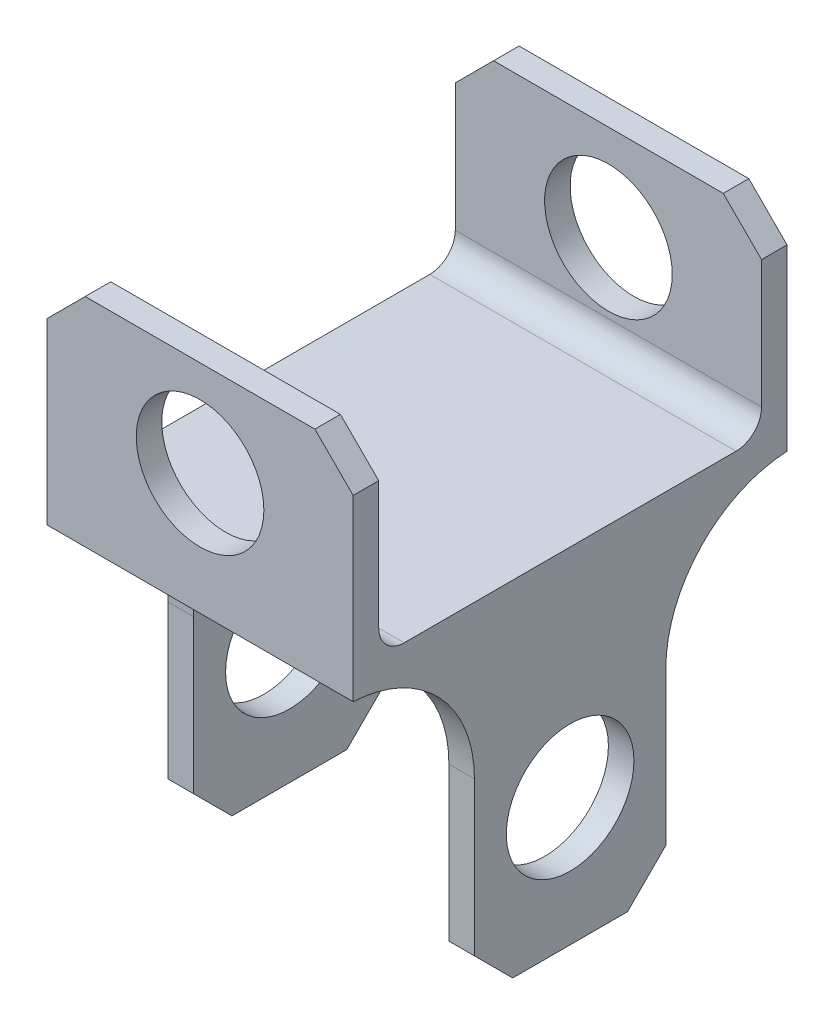
ISO-10303-21;
HEADER;
FILE_DESCRIPTION(('STEP AP214'),'2;1');
FILE_NAME('part.step','',(''),(''),'','','');
FILE_SCHEMA(('AUTOMOTIVE_DESIGN { 1 0 10303 214 1 1 1 1 }'));
ENDSEC;
DATA;
#1=APPLICATION_CONTEXT('core data for automotive mechanical design processes');
#2=APPLICATION_PROTOCOL_DEFINITION('international standard','automotive_design',2000,#1);
#3=PRODUCT_CONTEXT('',#1,'mechanical');
#4=PRODUCT('Part','Part','',(#3));
#5=PRODUCT_RELATED_PRODUCT_CATEGORY('part','',(#4));
#6=PRODUCT_DEFINITION_FORMATION('','',#4);
#7=PRODUCT_DEFINITION_CONTEXT('part definition',#1,'design');
#8=PRODUCT_DEFINITION('design','',#6,#7);
#9=PRODUCT_DEFINITION_SHAPE('','',#8);
#10=(LENGTH_UNIT() NAMED_UNIT(*) SI_UNIT(.MILLI.,.METRE.));
#11=(NAMED_UNIT(*) PLANE_ANGLE_UNIT() SI_UNIT($,.RADIAN.));
#12=(NAMED_UNIT(*) SI_UNIT($,.STERADIAN.) SOLID_ANGLE_UNIT());
#13=UNCERTAINTY_MEASURE_WITH_UNIT(LENGTH_MEASURE(1.E-05),#10,'distance_accuracy_value','');
#14=(GEOMETRIC_REPRESENTATION_CONTEXT(3) GLOBAL_UNCERTAINTY_ASSIGNED_CONTEXT((#13)) GLOBAL_UNIT_ASSIGNED_CONTEXT((#10,
#11,#12)) REPRESENTATION_CONTEXT('',''));
#15=CARTESIAN_POINT('',(0.,0.,0.));
#16=DIRECTION('',(0.,0.,1.));
#17=DIRECTION('',(1.,0.,0.));
#18=AXIS2_PLACEMENT_3D('',#15,#16,#17);
#19=CARTESIAN_POINT('',(0.,0.,2.));
#20=DIRECTION('',(0.,0.,1.));
#21=DIRECTION('',(1.,0.,0.));
#22=AXIS2_PLACEMENT_3D('',#19,#20,#21);
#23=PLANE('',#22);
#24=CARTESIAN_POINT('',(0.,0.,2.));
#25=DIRECTION('',(0.,0.,1.));
#26=DIRECTION('',(1.,0.,0.));
#27=AXIS2_PLACEMENT_3D('',#24,#25,#26);
#28=CIRCLE('',#27,5.);
#29=CARTESIAN_POINT('',(5.,0.,2.));
#30=VERTEX_POINT('',#29);
#31=EDGE_CURVE('E246',#30,#30,#28,.T.);
#32=ORIENTED_EDGE('',*,*,#31,.F.);
#33=EDGE_LOOP('',(#32));
#34=FACE_BOUND('',#33,.T.);
#35=DIRECTION('',(0.,1.,0.));
#36=VECTOR('',#35,1.);
#37=CARTESIAN_POINT('',(12.,0.,2.));
#38=LINE('',#37,#36);
#39=CARTESIAN_POINT('',(12.,-9.5,2.));
#40=VERTEX_POINT('',#39);
#41=CARTESIAN_POINT('',(12.,4.49999999999998,2.));
#42=VERTEX_POINT('',#41);
#43=EDGE_CURVE('E251',#40,#42,#38,.T.);
#44=ORIENTED_EDGE('',*,*,#43,.T.);
#45=DIRECTION('',(-0.707106781186547,0.707106781186548,0.));
#46=VECTOR('',#45,1.);
#47=CARTESIAN_POINT('',(8.25000000000001,8.24999999999998,2.));
#48=LINE('',#47,#46);
#49=CARTESIAN_POINT('',(8.99999999999999,7.5,2.));
#50=VERTEX_POINT('',#49);
#51=EDGE_CURVE('E275',#42,#50,#48,.T.);
#52=ORIENTED_EDGE('',*,*,#51,.T.);
#53=DIRECTION('',(1.,0.,0.));
#54=VECTOR('',#53,1.);
#55=CARTESIAN_POINT('',(0.,7.5,2.));
#56=LINE('',#55,#54);
#57=CARTESIAN_POINT('',(-9.,7.5,2.));
#58=VERTEX_POINT('',#57);
#59=EDGE_CURVE('E254',#58,#50,#56,.T.);
#60=ORIENTED_EDGE('',*,*,#59,.F.);
#61=DIRECTION('',(0.707106781186549,0.707106781186546,0.));
#62=VECTOR('',#61,1.);
#63=CARTESIAN_POINT('',(-8.24999999999998,8.25000000000002,2.));
#64=LINE('',#63,#62);
#65=CARTESIAN_POINT('',(-12.,4.50000000000001,2.));
#66=VERTEX_POINT('',#65);
#67=EDGE_CURVE('E244',#58,#66,#64,.F.);
#68=ORIENTED_EDGE('',*,*,#67,.T.);
#69=DIRECTION('',(0.,1.,0.));
#70=VECTOR('',#69,1.);
#71=CARTESIAN_POINT('',(-12.,0.,2.));
#72=LINE('',#71,#70);
#73=CARTESIAN_POINT('',(-12.,-9.5,2.));
#74=VERTEX_POINT('',#73);
#75=EDGE_CURVE('E227',#74,#66,#72,.T.);
#76=ORIENTED_EDGE('',*,*,#75,.F.);
#77=DIRECTION('',(1.,0.,0.));
#78=VECTOR('',#77,1.);
#79=CARTESIAN_POINT('',(0.,-9.5,2.));
#80=LINE('',#79,#78);
#81=CARTESIAN_POINT('',(-10.,-9.5,2.));
#82=VERTEX_POINT('',#81);
#83=EDGE_CURVE('E241',#74,#82,#80,.T.);
#84=ORIENTED_EDGE('',*,*,#83,.T.);
#85=CARTESIAN_POINT('',(10.,-9.5,2.));
#86=VERTEX_POINT('',#85);
#87=EDGE_CURVE('E252',#82,#86,#80,.T.);
#88=ORIENTED_EDGE('',*,*,#87,.T.);
#89=EDGE_CURVE('E245',#86,#40,#80,.T.);
#90=ORIENTED_EDGE('',*,*,#89,.T.);
#91=EDGE_LOOP('',(#44,#52,#60,#68,#76,#84,#88,#90));
#92=FACE_BOUND('',#91,.T.);
#93=ADVANCED_FACE('F36',(#34,#92),#23,.T.);
#94=CARTESIAN_POINT('',(0.,-9.5,2.));
#95=DIRECTION('',(0.,1.,0.));
#96=DIRECTION('',(-1.,0.,0.));
#97=AXIS2_PLACEMENT_3D('',#94,#95,#96);
#98=PLANE('',#97);
#99=DIRECTION('',(0.,0.,-1.));
#100=VECTOR('',#99,1.);
#101=CARTESIAN_POINT('',(10.,-9.5,-32.));
#102=LINE('',#101,#100);
#103=CARTESIAN_POINT('',(10.,-9.5,-32.));
#104=VERTEX_POINT('',#103);
#105=EDGE_CURVE('E356',#86,#104,#102,.T.);
#106=ORIENTED_EDGE('',*,*,#105,.F.);
#107=ORIENTED_EDGE('',*,*,#87,.F.);
#108=DIRECTION('',(0.,0.,1.));
#109=VECTOR('',#108,1.);
#110=CARTESIAN_POINT('',(-10.,-9.5,-32.));
#111=LINE('',#110,#109);
#112=CARTESIAN_POINT('',(-10.,-9.5,-32.));
#113=VERTEX_POINT('',#112);
#114=EDGE_CURVE('E363',#113,#82,#111,.T.);
#115=ORIENTED_EDGE('',*,*,#114,.F.);
#116=DIRECTION('',(1.,0.,0.));
#117=VECTOR('',#116,1.);
#118=CARTESIAN_POINT('',(0.,-9.5,-32.));
#119=LINE('',#118,#117);
#120=EDGE_CURVE('E390',#113,#104,#119,.T.);
#121=ORIENTED_EDGE('',*,*,#120,.T.);
#122=EDGE_LOOP('',(#106,#107,#115,#121));
#123=FACE_BOUND('',#122,.T.);
#124=ADVANCED_FACE('F511',(#123),#98,.F.);
#125=CARTESIAN_POINT('',(0.,0.,0.));
#126=DIRECTION('',(0.,0.,1.));
#127=DIRECTION('',(1.,0.,0.));
#128=AXIS2_PLACEMENT_3D('',#125,#126,#127);
#129=PLANE('',#128);
#130=CARTESIAN_POINT('',(0.,0.,0.));
#131=DIRECTION('',(0.,0.,1.));
#132=DIRECTION('',(1.,0.,0.));
#133=AXIS2_PLACEMENT_3D('',#130,#131,#132);
#134=CIRCLE('',#133,5.);
#135=CARTESIAN_POINT('',(5.,0.,0.));
#136=VERTEX_POINT('',#135);
#137=EDGE_CURVE('E404',#136,#136,#134,.T.);
#138=ORIENTED_EDGE('',*,*,#137,.T.);
#139=EDGE_LOOP('',(#138));
#140=FACE_BOUND('',#139,.T.);
#141=DIRECTION('',(1.,0.,0.));
#142=VECTOR('',#141,1.);
#143=CARTESIAN_POINT('',(0.,7.5,0.));
#144=LINE('',#143,#142);
#145=CARTESIAN_POINT('',(-9.,7.5,0.));
#146=VERTEX_POINT('',#145);
#147=CARTESIAN_POINT('',(8.99999999999999,7.5,0.));
#148=VERTEX_POINT('',#147);
#149=EDGE_CURVE('E408',#146,#148,#144,.T.);
#150=ORIENTED_EDGE('',*,*,#149,.T.);
#151=DIRECTION('',(0.707106781186547,-0.707106781186548,0.));
#152=VECTOR('',#151,1.);
#153=CARTESIAN_POINT('',(8.99999999999999,7.5,0.));
#154=LINE('',#153,#152);
#155=CARTESIAN_POINT('',(12.,4.49999999999998,0.));
#156=VERTEX_POINT('',#155);
#157=EDGE_CURVE('E470',#148,#156,#154,.T.);
#158=ORIENTED_EDGE('',*,*,#157,.T.);
#159=DIRECTION('',(0.,1.,0.));
#160=VECTOR('',#159,1.);
#161=CARTESIAN_POINT('',(12.,0.,0.));
#162=LINE('',#161,#160);
#163=CARTESIAN_POINT('',(12.,-5.5,0.));
#164=VERTEX_POINT('',#163);
#165=EDGE_CURVE('E271',#164,#156,#162,.T.);
#166=ORIENTED_EDGE('',*,*,#165,.F.);
#167=DIRECTION('',(1.,0.,0.));
#168=VECTOR('',#167,1.);
#169=CARTESIAN_POINT('',(-12.,-5.5,0.));
#170=LINE('',#169,#168);
#171=CARTESIAN_POINT('',(-12.,-5.5,0.));
#172=VERTEX_POINT('',#171);
#173=EDGE_CURVE('E453',#164,#172,#170,.F.);
#174=ORIENTED_EDGE('',*,*,#173,.T.);
#175=DIRECTION('',(0.,1.,0.));
#176=VECTOR('',#175,1.);
#177=CARTESIAN_POINT('',(-12.,0.,0.));
#178=LINE('',#177,#176);
#179=CARTESIAN_POINT('',(-12.,4.50000000000001,0.));
#180=VERTEX_POINT('',#179);
#181=EDGE_CURVE('E415',#172,#180,#178,.T.);
#182=ORIENTED_EDGE('',*,*,#181,.T.);
#183=DIRECTION('',(-0.707106781186549,-0.707106781186546,0.));
#184=VECTOR('',#183,1.);
#185=CARTESIAN_POINT('',(-12.,4.50000000000001,0.));
#186=LINE('',#185,#184);
#187=EDGE_CURVE('E468',#180,#146,#186,.F.);
#188=ORIENTED_EDGE('',*,*,#187,.T.);
#189=EDGE_LOOP('',(#150,#158,#166,#174,#182,#188));
#190=FACE_BOUND('',#189,.T.);
#191=ADVANCED_FACE('F517',(#140,#190),#129,.F.);
#192=CARTESIAN_POINT('',(-12.,0.,2.));
#193=DIRECTION('',(-1.,0.,0.));
#194=DIRECTION('',(0.,0.,1.));
#195=AXIS2_PLACEMENT_3D('',#192,#193,#194);
#196=PLANE('',#195);
#197=CARTESIAN_POINT('',(-12.,-24.5,-15.));
#198=DIRECTION('',(-1.,0.,0.));
#199=DIRECTION('',(0.,0.,1.));
#200=AXIS2_PLACEMENT_3D('',#197,#198,#199);
#201=CIRCLE('',#200,5.);
#202=CARTESIAN_POINT('',(-12.,-24.5,-10.));
#203=VERTEX_POINT('',#202);
#204=EDGE_CURVE('E344',#203,#203,#201,.T.);
#205=ORIENTED_EDGE('',*,*,#204,.F.);
#206=EDGE_LOOP('',(#205));
#207=FACE_BOUND('',#206,.T.);
#208=ORIENTED_EDGE('',*,*,#75,.T.);
#209=DIRECTION('',(0.,0.,-1.));
#210=VECTOR('',#209,1.);
#211=CARTESIAN_POINT('',(-12.,4.50000000000001,2.));
#212=LINE('',#211,#210);
#213=EDGE_CURVE('E289',#66,#180,#212,.T.);
#214=ORIENTED_EDGE('',*,*,#213,.T.);
#215=ORIENTED_EDGE('',*,*,#181,.F.);
#216=CARTESIAN_POINT('',(-12.,-5.5,-2.));
#217=DIRECTION('',(-1.,0.,0.));
#218=DIRECTION('',(0.,0.,1.));
#219=AXIS2_PLACEMENT_3D('',#216,#217,#218);
#220=CIRCLE('',#219,2.);
#221=CARTESIAN_POINT('',(-12.,-7.5,-2.));
#222=VERTEX_POINT('',#221);
#223=EDGE_CURVE('E461',#172,#222,#220,.F.);
#224=ORIENTED_EDGE('',*,*,#223,.T.);
#225=DIRECTION('',(0.,0.,1.));
#226=VECTOR('',#225,1.);
#227=CARTESIAN_POINT('',(-12.,-7.5,-30.));
#228=LINE('',#227,#226);
#229=CARTESIAN_POINT('',(-12.,-7.5,-28.));
#230=VERTEX_POINT('',#229);
#231=EDGE_CURVE('E401',#230,#222,#228,.T.);
#232=ORIENTED_EDGE('',*,*,#231,.F.);
#233=CARTESIAN_POINT('',(-12.,-5.5,-28.));
#234=DIRECTION('',(-1.,0.,0.));
#235=DIRECTION('',(0.,0.,1.));
#236=AXIS2_PLACEMENT_3D('',#233,#234,#235);
#237=CIRCLE('',#236,2.);
#238=CARTESIAN_POINT('',(-12.,-5.5,-30.));
#239=VERTEX_POINT('',#238);
#240=EDGE_CURVE('E457',#230,#239,#237,.F.);
#241=ORIENTED_EDGE('',*,*,#240,.T.);
#242=DIRECTION('',(0.,1.,0.));
#243=VECTOR('',#242,1.);
#244=CARTESIAN_POINT('',(-12.,0.,-30.));
#245=LINE('',#244,#243);
#246=CARTESIAN_POINT('',(-12.,4.49999999999998,-30.));
#247=VERTEX_POINT('',#246);
#248=EDGE_CURVE('E393',#239,#247,#245,.T.);
#249=ORIENTED_EDGE('',*,*,#248,.T.);
#250=DIRECTION('',(0.,0.,-1.));
#251=VECTOR('',#250,1.);
#252=CARTESIAN_POINT('',(-12.,4.49999999999998,-32.));
#253=LINE('',#252,#251);
#254=CARTESIAN_POINT('',(-12.,4.49999999999998,-32.));
#255=VERTEX_POINT('',#254);
#256=EDGE_CURVE('E287',#247,#255,#253,.T.);
#257=ORIENTED_EDGE('',*,*,#256,.T.);
#258=DIRECTION('',(0.,1.,0.));
#259=VECTOR('',#258,1.);
#260=CARTESIAN_POINT('',(-12.,0.,-32.));
#261=LINE('',#260,#259);
#262=CARTESIAN_POINT('',(-12.,-9.5,-32.));
#263=VERTEX_POINT('',#262);
#264=EDGE_CURVE('E375',#263,#255,#261,.T.);
#265=ORIENTED_EDGE('',*,*,#264,.F.);
#266=CARTESIAN_POINT('',(-12.,-19.4874921777191,-32.5));
#267=DIRECTION('',(-1.,0.,0.));
#268=DIRECTION('',(0.,0.,1.));
#269=AXIS2_PLACEMENT_3D('',#266,#267,#268);
#270=CIRCLE('',#269,10.);
#271=CARTESIAN_POINT('',(-12.,-19.4874921777191,-22.5));
#272=VERTEX_POINT('',#271);
#273=EDGE_CURVE('E440',#263,#272,#270,.F.);
#274=ORIENTED_EDGE('',*,*,#273,.T.);
#275=DIRECTION('',(0.,-1.,0.));
#276=VECTOR('',#275,1.);
#277=CARTESIAN_POINT('',(-12.,-9.5,-22.5));
#278=LINE('',#277,#276);
#279=CARTESIAN_POINT('',(-12.,-31.5,-22.5));
#280=VERTEX_POINT('',#279);
#281=EDGE_CURVE('E339',#272,#280,#278,.T.);
#282=ORIENTED_EDGE('',*,*,#281,.T.);
#283=DIRECTION('',(0.,0.707106781186546,-0.707106781186549));
#284=VECTOR('',#283,1.);
#285=CARTESIAN_POINT('',(-12.,-28.0000000000001,-25.9999999999999));
#286=LINE('',#285,#284);
#287=CARTESIAN_POINT('',(-12.,-34.5,-19.5));
#288=VERTEX_POINT('',#287);
#289=EDGE_CURVE('E285',#280,#288,#286,.F.);
#290=ORIENTED_EDGE('',*,*,#289,.T.);
#291=DIRECTION('',(0.,0.,-1.));
#292=VECTOR('',#291,1.);
#293=CARTESIAN_POINT('',(-12.,-34.5,-32.));
#294=LINE('',#293,#292);
#295=CARTESIAN_POINT('',(-12.,-34.5,-10.5));
#296=VERTEX_POINT('',#295);
#297=EDGE_CURVE('E365',#296,#288,#294,.T.);
#298=ORIENTED_EDGE('',*,*,#297,.F.);
#299=DIRECTION('',(0.,-0.707106781186545,-0.70710678118655));
#300=VECTOR('',#299,1.);
#301=CARTESIAN_POINT('',(-12.,-11.0000000000001,13.));
#302=LINE('',#301,#300);
#303=CARTESIAN_POINT('',(-12.,-31.5,-7.5));
#304=VERTEX_POINT('',#303);
#305=EDGE_CURVE('E283',#296,#304,#302,.F.);
#306=ORIENTED_EDGE('',*,*,#305,.T.);
#307=DIRECTION('',(0.,-1.,0.));
#308=VECTOR('',#307,1.);
#309=CARTESIAN_POINT('',(-12.,-9.5,-7.5));
#310=LINE('',#309,#308);
#311=CARTESIAN_POINT('',(-12.,-19.4874921777191,-7.5));
#312=VERTEX_POINT('',#311);
#313=EDGE_CURVE('E230',#312,#304,#310,.T.);
#314=ORIENTED_EDGE('',*,*,#313,.F.);
#315=CARTESIAN_POINT('',(-12.,-19.4874921777191,2.5));
#316=DIRECTION('',(-1.,0.,0.));
#317=DIRECTION('',(0.,0.,1.));
#318=AXIS2_PLACEMENT_3D('',#315,#316,#317);
#319=CIRCLE('',#318,10.);
#320=EDGE_CURVE('E223',#312,#74,#319,.F.);
#321=ORIENTED_EDGE('',*,*,#320,.T.);
#322=EDGE_LOOP('',(#208,#214,#215,#224,#232,#241,#249,#257,#265,#274,#282,#290,#298,#306,#314,#321));
#323=FACE_BOUND('',#322,.T.);
#324=ADVANCED_FACE('F225',(#207,#323),#196,.T.);
#325=CARTESIAN_POINT('',(12.,0.,2.));
#326=DIRECTION('',(-1.,0.,0.));
#327=DIRECTION('',(0.,0.,1.));
#328=AXIS2_PLACEMENT_3D('',#325,#326,#327);
#329=PLANE('',#328);
#330=CARTESIAN_POINT('',(12.,-24.5,-15.));
#331=DIRECTION('',(1.,0.,0.));
#332=DIRECTION('',(0.,0.,-1.));
#333=AXIS2_PLACEMENT_3D('',#330,#331,#332);
#334=CIRCLE('',#333,5.);
#335=CARTESIAN_POINT('',(12.,-24.5,-20.));
#336=VERTEX_POINT('',#335);
#337=EDGE_CURVE('E423',#336,#336,#334,.T.);
#338=ORIENTED_EDGE('',*,*,#337,.F.);
#339=EDGE_LOOP('',(#338));
#340=FACE_BOUND('',#339,.T.);
#341=ORIENTED_EDGE('',*,*,#165,.T.);
#342=DIRECTION('',(0.,0.,1.));
#343=VECTOR('',#342,1.);
#344=CARTESIAN_POINT('',(12.,4.49999999999998,2.));
#345=LINE('',#344,#343);
#346=EDGE_CURVE('E269',#156,#42,#345,.T.);
#347=ORIENTED_EDGE('',*,*,#346,.T.);
#348=ORIENTED_EDGE('',*,*,#43,.F.);
#349=CARTESIAN_POINT('',(12.,-19.4874921777191,2.5));
#350=DIRECTION('',(-1.,0.,0.));
#351=DIRECTION('',(0.,0.,1.));
#352=AXIS2_PLACEMENT_3D('',#349,#350,#351);
#353=CIRCLE('',#352,10.);
#354=CARTESIAN_POINT('',(12.,-19.4874921777191,-7.5));
#355=VERTEX_POINT('',#354);
#356=EDGE_CURVE('E266',#40,#355,#353,.T.);
#357=ORIENTED_EDGE('',*,*,#356,.T.);
#358=DIRECTION('',(0.,-1.,0.));
#359=VECTOR('',#358,1.);
#360=CARTESIAN_POINT('',(12.,-9.5,-7.5));
#361=LINE('',#360,#359);
#362=CARTESIAN_POINT('',(12.,-31.5,-7.5));
#363=VERTEX_POINT('',#362);
#364=EDGE_CURVE('E341',#355,#363,#361,.T.);
#365=ORIENTED_EDGE('',*,*,#364,.T.);
#366=DIRECTION('',(0.,0.707106781186545,0.70710678118655));
#367=VECTOR('',#366,1.);
#368=CARTESIAN_POINT('',(12.,-31.5,-7.5));
#369=LINE('',#368,#367);
#370=CARTESIAN_POINT('',(12.,-34.5,-10.5));
#371=VERTEX_POINT('',#370);
#372=EDGE_CURVE('E472',#363,#371,#369,.F.);
#373=ORIENTED_EDGE('',*,*,#372,.T.);
#374=DIRECTION('',(0.,0.,1.));
#375=VECTOR('',#374,1.);
#376=CARTESIAN_POINT('',(12.,-34.5,-32.));
#377=LINE('',#376,#375);
#378=CARTESIAN_POINT('',(12.,-34.5,-19.5));
#379=VERTEX_POINT('',#378);
#380=EDGE_CURVE('E358',#379,#371,#377,.T.);
#381=ORIENTED_EDGE('',*,*,#380,.F.);
#382=DIRECTION('',(0.,-0.707106781186546,0.707106781186549));
#383=VECTOR('',#382,1.);
#384=CARTESIAN_POINT('',(12.,-31.5,-22.5));
#385=LINE('',#384,#383);
#386=CARTESIAN_POINT('',(12.,-31.5,-22.5));
#387=VERTEX_POINT('',#386);
#388=EDGE_CURVE('E278',#379,#387,#385,.F.);
#389=ORIENTED_EDGE('',*,*,#388,.T.);
#390=DIRECTION('',(0.,-1.,0.));
#391=VECTOR('',#390,1.);
#392=CARTESIAN_POINT('',(12.,-9.5,-22.5));
#393=LINE('',#392,#391);
#394=CARTESIAN_POINT('',(12.,-19.4874921777191,-22.5));
#395=VERTEX_POINT('',#394);
#396=EDGE_CURVE('E352',#395,#387,#393,.T.);
#397=ORIENTED_EDGE('',*,*,#396,.F.);
#398=CARTESIAN_POINT('',(12.,-19.4874921777191,-32.5));
#399=DIRECTION('',(-1.,0.,0.));
#400=DIRECTION('',(0.,0.,1.));
#401=AXIS2_PLACEMENT_3D('',#398,#399,#400);
#402=CIRCLE('',#401,10.);
#403=CARTESIAN_POINT('',(12.,-9.5,-32.));
#404=VERTEX_POINT('',#403);
#405=EDGE_CURVE('E438',#395,#404,#402,.T.);
#406=ORIENTED_EDGE('',*,*,#405,.T.);
#407=DIRECTION('',(0.,1.,0.));
#408=VECTOR('',#407,1.);
#409=CARTESIAN_POINT('',(12.,0.,-32.));
#410=LINE('',#409,#408);
#411=CARTESIAN_POINT('',(12.,4.50000000000001,-32.));
#412=VERTEX_POINT('',#411);
#413=EDGE_CURVE('E382',#404,#412,#410,.T.);
#414=ORIENTED_EDGE('',*,*,#413,.T.);
#415=DIRECTION('',(0.,0.,1.));
#416=VECTOR('',#415,1.);
#417=CARTESIAN_POINT('',(12.,4.50000000000001,2.));
#418=LINE('',#417,#416);
#419=CARTESIAN_POINT('',(12.,4.50000000000001,-30.));
#420=VERTEX_POINT('',#419);
#421=EDGE_CURVE('E273',#412,#420,#418,.T.);
#422=ORIENTED_EDGE('',*,*,#421,.T.);
#423=DIRECTION('',(0.,1.,0.));
#424=VECTOR('',#423,1.);
#425=CARTESIAN_POINT('',(12.,0.,-30.));
#426=LINE('',#425,#424);
#427=CARTESIAN_POINT('',(12.,-5.5,-30.));
#428=VERTEX_POINT('',#427);
#429=EDGE_CURVE('E376',#428,#420,#426,.T.);
#430=ORIENTED_EDGE('',*,*,#429,.F.);
#431=CARTESIAN_POINT('',(12.,-5.5,-28.));
#432=DIRECTION('',(-1.,0.,0.));
#433=DIRECTION('',(0.,0.,1.));
#434=AXIS2_PLACEMENT_3D('',#431,#432,#433);
#435=CIRCLE('',#434,2.);
#436=CARTESIAN_POINT('',(12.,-7.5,-28.));
#437=VERTEX_POINT('',#436);
#438=EDGE_CURVE('E455',#428,#437,#435,.T.);
#439=ORIENTED_EDGE('',*,*,#438,.T.);
#440=DIRECTION('',(0.,0.,1.));
#441=VECTOR('',#440,1.);
#442=CARTESIAN_POINT('',(12.,-7.5,-30.));
#443=LINE('',#442,#441);
#444=CARTESIAN_POINT('',(12.,-7.5,-2.));
#445=VERTEX_POINT('',#444);
#446=EDGE_CURVE('E389',#437,#445,#443,.T.);
#447=ORIENTED_EDGE('',*,*,#446,.T.);
#448=CARTESIAN_POINT('',(12.,-5.5,-2.));
#449=DIRECTION('',(-1.,0.,0.));
#450=DIRECTION('',(0.,0.,1.));
#451=AXIS2_PLACEMENT_3D('',#448,#449,#450);
#452=CIRCLE('',#451,2.);
#453=EDGE_CURVE('E459',#445,#164,#452,.T.);
#454=ORIENTED_EDGE('',*,*,#453,.T.);
#455=EDGE_LOOP('',(#341,#347,#348,#357,#365,#373,#381,#389,#397,#406,#414,#422,#430,#439,#447,#454));
#456=FACE_BOUND('',#455,.T.);
#457=ADVANCED_FACE('F264',(#340,#456),#329,.F.);
#458=CARTESIAN_POINT('',(0.,0.,2.));
#459=DIRECTION('',(0.,0.,-1.));
#460=DIRECTION('',(-1.,0.,0.));
#461=AXIS2_PLACEMENT_3D('',#458,#459,#460);
#462=CYLINDRICAL_SURFACE('',#461,5.);
#463=ORIENTED_EDGE('',*,*,#31,.T.);
#464=EDGE_LOOP('',(#463));
#465=FACE_BOUND('',#464,.T.);
#466=ORIENTED_EDGE('',*,*,#137,.F.);
#467=EDGE_LOOP('',(#466));
#468=FACE_BOUND('',#467,.T.);
#469=ADVANCED_FACE('F530',(#465,#468),#462,.F.);
#470=CARTESIAN_POINT('',(0.,7.5,2.));
#471=DIRECTION('',(0.,1.,0.));
#472=DIRECTION('',(0.,0.,1.));
#473=AXIS2_PLACEMENT_3D('',#470,#471,#472);
#474=PLANE('',#473);
#475=ORIENTED_EDGE('',*,*,#59,.T.);
#476=DIRECTION('',(0.,0.,-1.));
#477=VECTOR('',#476,1.);
#478=CARTESIAN_POINT('',(8.99999999999999,7.5,0.));
#479=LINE('',#478,#477);
#480=EDGE_CURVE('E465',#50,#148,#479,.T.);
#481=ORIENTED_EDGE('',*,*,#480,.T.);
#482=ORIENTED_EDGE('',*,*,#149,.F.);
#483=DIRECTION('',(0.,0.,1.));
#484=VECTOR('',#483,1.);
#485=CARTESIAN_POINT('',(-9.,7.5,2.));
#486=LINE('',#485,#484);
#487=EDGE_CURVE('E463',#146,#58,#486,.T.);
#488=ORIENTED_EDGE('',*,*,#487,.T.);
#489=EDGE_LOOP('',(#475,#481,#482,#488));
#490=FACE_BOUND('',#489,.T.);
#491=ADVANCED_FACE('F527',(#490),#474,.T.);
#492=CARTESIAN_POINT('',(0.,-7.5,-30.));
#493=DIRECTION('',(0.,-1.,0.));
#494=DIRECTION('',(0.,0.,-1.));
#495=AXIS2_PLACEMENT_3D('',#492,#493,#494);
#496=PLANE('',#495);
#497=ORIENTED_EDGE('',*,*,#446,.F.);
#498=DIRECTION('',(1.,0.,0.));
#499=VECTOR('',#498,1.);
#500=CARTESIAN_POINT('',(-12.,-7.5,-28.));
#501=LINE('',#500,#499);
#502=EDGE_CURVE('E451',#437,#230,#501,.F.);
#503=ORIENTED_EDGE('',*,*,#502,.T.);
#504=ORIENTED_EDGE('',*,*,#231,.T.);
#505=DIRECTION('',(1.,0.,0.));
#506=VECTOR('',#505,1.);
#507=CARTESIAN_POINT('',(12.,-7.5,-2.));
#508=LINE('',#507,#506);
#509=EDGE_CURVE('E448',#222,#445,#508,.T.);
#510=ORIENTED_EDGE('',*,*,#509,.T.);
#511=EDGE_LOOP('',(#497,#503,#504,#510));
#512=FACE_BOUND('',#511,.T.);
#513=ADVANCED_FACE('F522',(#512),#496,.F.);
#514=CARTESIAN_POINT('',(0.,0.,-30.));
#515=DIRECTION('',(0.,0.,-1.));
#516=DIRECTION('',(1.,0.,0.));
#517=AXIS2_PLACEMENT_3D('',#514,#515,#516);
#518=PLANE('',#517);
#519=CARTESIAN_POINT('',(0.,0.,-30.));
#520=DIRECTION('',(0.,0.,1.));
#521=DIRECTION('',(1.,0.,0.));
#522=AXIS2_PLACEMENT_3D('',#519,#520,#521);
#523=CIRCLE('',#522,5.);
#524=CARTESIAN_POINT('',(5.,0.,-30.));
#525=VERTEX_POINT('',#524);
#526=EDGE_CURVE('E370',#525,#525,#523,.T.);
#527=ORIENTED_EDGE('',*,*,#526,.F.);
#528=EDGE_LOOP('',(#527));
#529=FACE_BOUND('',#528,.T.);
#530=DIRECTION('',(1.,0.,0.));
#531=VECTOR('',#530,1.);
#532=CARTESIAN_POINT('',(0.,7.5,-30.));
#533=LINE('',#532,#531);
#534=CARTESIAN_POINT('',(-8.99999999999999,7.5,-30.));
#535=VERTEX_POINT('',#534);
#536=CARTESIAN_POINT('',(9.,7.5,-30.));
#537=VERTEX_POINT('',#536);
#538=EDGE_CURVE('E396',#535,#537,#533,.T.);
#539=ORIENTED_EDGE('',*,*,#538,.F.);
#540=DIRECTION('',(-0.707106781186547,-0.707106781186548,0.));
#541=VECTOR('',#540,1.);
#542=CARTESIAN_POINT('',(-8.99999999999999,7.5,-30.));
#543=LINE('',#542,#541);
#544=EDGE_CURVE('E298',#535,#247,#543,.T.);
#545=ORIENTED_EDGE('',*,*,#544,.T.);
#546=ORIENTED_EDGE('',*,*,#248,.F.);
#547=DIRECTION('',(1.,0.,0.));
#548=VECTOR('',#547,1.);
#549=CARTESIAN_POINT('',(12.,-5.5,-30.));
#550=LINE('',#549,#548);
#551=EDGE_CURVE('E234',#239,#428,#550,.T.);
#552=ORIENTED_EDGE('',*,*,#551,.T.);
#553=ORIENTED_EDGE('',*,*,#429,.T.);
#554=DIRECTION('',(0.707106781186549,-0.707106781186546,0.));
#555=VECTOR('',#554,1.);
#556=CARTESIAN_POINT('',(12.,4.50000000000001,-30.));
#557=LINE('',#556,#555);
#558=EDGE_CURVE('E296',#420,#537,#557,.F.);
#559=ORIENTED_EDGE('',*,*,#558,.T.);
#560=EDGE_LOOP('',(#539,#545,#546,#552,#553,#559));
#561=FACE_BOUND('',#560,.T.);
#562=ADVANCED_FACE('F568',(#529,#561),#518,.F.);
#563=CARTESIAN_POINT('',(0.,7.5,-32.));
#564=DIRECTION('',(0.,-1.,0.));
#565=DIRECTION('',(0.,0.,-1.));
#566=AXIS2_PLACEMENT_3D('',#563,#564,#565);
#567=PLANE('',#566);
#568=DIRECTION('',(1.,0.,0.));
#569=VECTOR('',#568,1.);
#570=CARTESIAN_POINT('',(0.,7.5,-32.));
#571=LINE('',#570,#569);
#572=CARTESIAN_POINT('',(-8.99999999999999,7.5,-32.));
#573=VERTEX_POINT('',#572);
#574=CARTESIAN_POINT('',(9.,7.5,-32.));
#575=VERTEX_POINT('',#574);
#576=EDGE_CURVE('E379',#573,#575,#571,.T.);
#577=ORIENTED_EDGE('',*,*,#576,.F.);
#578=DIRECTION('',(0.,0.,1.));
#579=VECTOR('',#578,1.);
#580=CARTESIAN_POINT('',(-8.99999999999999,7.5,-30.));
#581=LINE('',#580,#579);
#582=EDGE_CURVE('E293',#573,#535,#581,.T.);
#583=ORIENTED_EDGE('',*,*,#582,.T.);
#584=ORIENTED_EDGE('',*,*,#538,.T.);
#585=DIRECTION('',(0.,0.,-1.));
#586=VECTOR('',#585,1.);
#587=CARTESIAN_POINT('',(9.,7.5,-32.));
#588=LINE('',#587,#586);
#589=EDGE_CURVE('E291',#537,#575,#588,.T.);
#590=ORIENTED_EDGE('',*,*,#589,.T.);
#591=EDGE_LOOP('',(#577,#583,#584,#590));
#592=FACE_BOUND('',#591,.T.);
#593=ADVANCED_FACE('F576',(#592),#567,.F.);
#594=CARTESIAN_POINT('',(0.,0.,-32.));
#595=DIRECTION('',(0.,0.,1.));
#596=DIRECTION('',(1.,0.,0.));
#597=AXIS2_PLACEMENT_3D('',#594,#595,#596);
#598=CYLINDRICAL_SURFACE('',#597,5.);
#599=CARTESIAN_POINT('',(0.,0.,-32.));
#600=DIRECTION('',(0.,0.,1.));
#601=DIRECTION('',(1.,0.,0.));
#602=AXIS2_PLACEMENT_3D('',#599,#600,#601);
#603=CIRCLE('',#602,5.);
#604=CARTESIAN_POINT('',(5.,0.,-32.));
#605=VERTEX_POINT('',#604);
#606=EDGE_CURVE('E372',#605,#605,#603,.T.);
#607=ORIENTED_EDGE('',*,*,#606,.F.);
#608=EDGE_LOOP('',(#607));
#609=FACE_BOUND('',#608,.T.);
#610=ORIENTED_EDGE('',*,*,#526,.T.);
#611=EDGE_LOOP('',(#610));
#612=FACE_BOUND('',#611,.T.);
#613=ADVANCED_FACE('F822',(#609,#612),#598,.F.);
#614=CARTESIAN_POINT('',(0.,0.,-32.));
#615=DIRECTION('',(0.,0.,-1.));
#616=DIRECTION('',(1.,0.,0.));
#617=AXIS2_PLACEMENT_3D('',#614,#615,#616);
#618=PLANE('',#617);
#619=ORIENTED_EDGE('',*,*,#264,.T.);
#620=DIRECTION('',(0.707106781186547,0.707106781186548,0.));
#621=VECTOR('',#620,1.);
#622=CARTESIAN_POINT('',(-8.25000000000001,8.24999999999998,-32.));
#623=LINE('',#622,#621);
#624=EDGE_CURVE('E302',#255,#573,#623,.T.);
#625=ORIENTED_EDGE('',*,*,#624,.T.);
#626=ORIENTED_EDGE('',*,*,#576,.T.);
#627=DIRECTION('',(-0.707106781186549,0.707106781186546,0.));
#628=VECTOR('',#627,1.);
#629=CARTESIAN_POINT('',(8.24999999999998,8.25000000000002,-32.));
#630=LINE('',#629,#628);
#631=EDGE_CURVE('E300',#575,#412,#630,.F.);
#632=ORIENTED_EDGE('',*,*,#631,.T.);
#633=ORIENTED_EDGE('',*,*,#413,.F.);
#634=EDGE_CURVE('E385',#104,#404,#119,.T.);
#635=ORIENTED_EDGE('',*,*,#634,.F.);
#636=ORIENTED_EDGE('',*,*,#120,.F.);
#637=EDGE_CURVE('E386',#263,#113,#119,.T.);
#638=ORIENTED_EDGE('',*,*,#637,.F.);
#639=EDGE_LOOP('',(#619,#625,#626,#632,#633,#635,#636,#638));
#640=FACE_BOUND('',#639,.T.);
#641=ORIENTED_EDGE('',*,*,#606,.T.);
#642=EDGE_LOOP('',(#641));
#643=FACE_BOUND('',#642,.T.);
#644=ADVANCED_FACE('F580',(#640,#643),#618,.T.);
#645=CARTESIAN_POINT('',(-10.,-34.5,-32.));
#646=DIRECTION('',(-1.,0.,0.));
#647=DIRECTION('',(0.,0.,1.));
#648=AXIS2_PLACEMENT_3D('',#645,#646,#647);
#649=PLANE('',#648);
#650=CARTESIAN_POINT('',(-10.,-24.5,-15.));
#651=DIRECTION('',(-1.,0.,0.));
#652=DIRECTION('',(0.,0.,1.));
#653=AXIS2_PLACEMENT_3D('',#650,#651,#652);
#654=CIRCLE('',#653,5.);
#655=CARTESIAN_POINT('',(-10.,-24.5,-10.));
#656=VERTEX_POINT('',#655);
#657=EDGE_CURVE('E422',#656,#656,#654,.T.);
#658=ORIENTED_EDGE('',*,*,#657,.T.);
#659=EDGE_LOOP('',(#658));
#660=FACE_BOUND('',#659,.T.);
#661=DIRECTION('',(0.,0.,1.));
#662=VECTOR('',#661,1.);
#663=CARTESIAN_POINT('',(-10.,-34.5,-32.));
#664=LINE('',#663,#662);
#665=CARTESIAN_POINT('',(-10.,-34.5,-19.5));
#666=VERTEX_POINT('',#665);
#667=CARTESIAN_POINT('',(-10.,-34.5,-10.5));
#668=VERTEX_POINT('',#667);
#669=EDGE_CURVE('E368',#666,#668,#664,.T.);
#670=ORIENTED_EDGE('',*,*,#669,.F.);
#671=DIRECTION('',(0.,-0.707106781186546,0.707106781186549));
#672=VECTOR('',#671,1.);
#673=CARTESIAN_POINT('',(-10.,-31.5,-22.5));
#674=LINE('',#673,#672);
#675=CARTESIAN_POINT('',(-10.,-31.5,-22.5));
#676=VERTEX_POINT('',#675);
#677=EDGE_CURVE('E313',#666,#676,#674,.F.);
#678=ORIENTED_EDGE('',*,*,#677,.T.);
#679=DIRECTION('',(0.,-1.,0.));
#680=VECTOR('',#679,1.);
#681=CARTESIAN_POINT('',(-10.,-9.5,-22.5));
#682=LINE('',#681,#680);
#683=CARTESIAN_POINT('',(-10.,-19.4874921777191,-22.5));
#684=VERTEX_POINT('',#683);
#685=EDGE_CURVE('E336',#684,#676,#682,.T.);
#686=ORIENTED_EDGE('',*,*,#685,.F.);
#687=CARTESIAN_POINT('',(-10.,-19.4874921777191,-32.5));
#688=DIRECTION('',(-1.,0.,0.));
#689=DIRECTION('',(0.,0.,1.));
#690=AXIS2_PLACEMENT_3D('',#687,#688,#689);
#691=CIRCLE('',#690,10.);
#692=EDGE_CURVE('E442',#684,#113,#691,.T.);
#693=ORIENTED_EDGE('',*,*,#692,.T.);
#694=ORIENTED_EDGE('',*,*,#114,.T.);
#695=CARTESIAN_POINT('',(-10.,-19.4874921777191,2.5));
#696=DIRECTION('',(-1.,0.,0.));
#697=DIRECTION('',(0.,0.,1.));
#698=AXIS2_PLACEMENT_3D('',#695,#696,#697);
#699=CIRCLE('',#698,10.);
#700=CARTESIAN_POINT('',(-10.,-19.4874921777191,-7.5));
#701=VERTEX_POINT('',#700);
#702=EDGE_CURVE('E235',#82,#701,#699,.T.);
#703=ORIENTED_EDGE('',*,*,#702,.T.);
#704=DIRECTION('',(0.,-1.,0.));
#705=VECTOR('',#704,1.);
#706=CARTESIAN_POINT('',(-10.,-9.5,-7.5));
#707=LINE('',#706,#705);
#708=CARTESIAN_POINT('',(-10.,-31.5,-7.5));
#709=VERTEX_POINT('',#708);
#710=EDGE_CURVE('E329',#701,#709,#707,.T.);
#711=ORIENTED_EDGE('',*,*,#710,.T.);
#712=DIRECTION('',(0.,0.707106781186545,0.70710678118655));
#713=VECTOR('',#712,1.);
#714=CARTESIAN_POINT('',(-10.,-31.5,-7.5));
#715=LINE('',#714,#713);
#716=EDGE_CURVE('E311',#709,#668,#715,.F.);
#717=ORIENTED_EDGE('',*,*,#716,.T.);
#718=EDGE_LOOP('',(#670,#678,#686,#693,#694,#703,#711,#717));
#719=FACE_BOUND('',#718,.T.);
#720=ADVANCED_FACE('F334',(#660,#719),#649,.F.);
#721=CARTESIAN_POINT('',(0.,-34.5,0.));
#722=DIRECTION('',(0.,1.,0.));
#723=DIRECTION('',(0.,0.,1.));
#724=AXIS2_PLACEMENT_3D('',#721,#722,#723);
#725=PLANE('',#724);
#726=ORIENTED_EDGE('',*,*,#297,.T.);
#727=DIRECTION('',(1.,0.,0.));
#728=VECTOR('',#727,1.);
#729=CARTESIAN_POINT('',(0.,-34.5,-19.5));
#730=LINE('',#729,#728);
#731=EDGE_CURVE('E309',#288,#666,#730,.T.);
#732=ORIENTED_EDGE('',*,*,#731,.T.);
#733=ORIENTED_EDGE('',*,*,#669,.T.);
#734=DIRECTION('',(-1.,0.,0.));
#735=VECTOR('',#734,1.);
#736=CARTESIAN_POINT('',(0.,-34.5,-10.5));
#737=LINE('',#736,#735);
#738=EDGE_CURVE('E307',#668,#296,#737,.T.);
#739=ORIENTED_EDGE('',*,*,#738,.T.);
#740=EDGE_LOOP('',(#726,#732,#733,#739));
#741=FACE_BOUND('',#740,.T.);
#742=ADVANCED_FACE('F607',(#741),#725,.F.);
#743=CARTESIAN_POINT('',(10.,-34.5,-32.));
#744=DIRECTION('',(1.,0.,0.));
#745=DIRECTION('',(0.,0.,-1.));
#746=AXIS2_PLACEMENT_3D('',#743,#744,#745);
#747=PLANE('',#746);
#748=CARTESIAN_POINT('',(9.99999999999999,-24.5,-15.));
#749=DIRECTION('',(1.,0.,0.));
#750=DIRECTION('',(0.,0.,-1.));
#751=AXIS2_PLACEMENT_3D('',#748,#749,#750);
#752=CIRCLE('',#751,5.);
#753=CARTESIAN_POINT('',(9.99999999999999,-24.5,-20.));
#754=VERTEX_POINT('',#753);
#755=EDGE_CURVE('E419',#754,#754,#752,.T.);
#756=ORIENTED_EDGE('',*,*,#755,.T.);
#757=EDGE_LOOP('',(#756));
#758=FACE_BOUND('',#757,.T.);
#759=DIRECTION('',(0.,-1.,0.));
#760=VECTOR('',#759,1.);
#761=CARTESIAN_POINT('',(10.,-9.5,-22.5));
#762=LINE('',#761,#760);
#763=CARTESIAN_POINT('',(10.,-19.4874921777191,-22.5));
#764=VERTEX_POINT('',#763);
#765=CARTESIAN_POINT('',(10.,-31.5,-22.5));
#766=VERTEX_POINT('',#765);
#767=EDGE_CURVE('E350',#764,#766,#762,.T.);
#768=ORIENTED_EDGE('',*,*,#767,.T.);
#769=DIRECTION('',(0.,0.707106781186546,-0.707106781186549));
#770=VECTOR('',#769,1.);
#771=CARTESIAN_POINT('',(10.,-31.5,-22.5));
#772=LINE('',#771,#770);
#773=CARTESIAN_POINT('',(10.,-34.5,-19.5));
#774=VERTEX_POINT('',#773);
#775=EDGE_CURVE('E57',#766,#774,#772,.F.);
#776=ORIENTED_EDGE('',*,*,#775,.T.);
#777=DIRECTION('',(0.,0.,-1.));
#778=VECTOR('',#777,1.);
#779=CARTESIAN_POINT('',(10.,-34.5,-32.));
#780=LINE('',#779,#778);
#781=CARTESIAN_POINT('',(10.,-34.5,-10.5));
#782=VERTEX_POINT('',#781);
#783=EDGE_CURVE('E361',#782,#774,#780,.T.);
#784=ORIENTED_EDGE('',*,*,#783,.F.);
#785=DIRECTION('',(0.,-0.707106781186545,-0.70710678118655));
#786=VECTOR('',#785,1.);
#787=CARTESIAN_POINT('',(10.,-31.5,-7.5));
#788=LINE('',#787,#786);
#789=CARTESIAN_POINT('',(10.,-31.5,-7.5));
#790=VERTEX_POINT('',#789);
#791=EDGE_CURVE('E51',#782,#790,#788,.F.);
#792=ORIENTED_EDGE('',*,*,#791,.T.);
#793=DIRECTION('',(0.,-1.,0.));
#794=VECTOR('',#793,1.);
#795=CARTESIAN_POINT('',(10.,-9.5,-7.5));
#796=LINE('',#795,#794);
#797=CARTESIAN_POINT('',(10.,-19.4874921777191,-7.5));
#798=VERTEX_POINT('',#797);
#799=EDGE_CURVE('E348',#798,#790,#796,.T.);
#800=ORIENTED_EDGE('',*,*,#799,.F.);
#801=CARTESIAN_POINT('',(10.,-19.4874921777191,2.5));
#802=DIRECTION('',(1.,0.,0.));
#803=DIRECTION('',(0.,0.,-1.));
#804=AXIS2_PLACEMENT_3D('',#801,#802,#803);
#805=CIRCLE('',#804,10.);
#806=EDGE_CURVE('E433',#798,#86,#805,.T.);
#807=ORIENTED_EDGE('',*,*,#806,.T.);
#808=ORIENTED_EDGE('',*,*,#105,.T.);
#809=CARTESIAN_POINT('',(10.,-19.4874921777191,-32.5));
#810=DIRECTION('',(1.,0.,0.));
#811=DIRECTION('',(0.,0.,-1.));
#812=AXIS2_PLACEMENT_3D('',#809,#810,#811);
#813=CIRCLE('',#812,10.);
#814=EDGE_CURVE('E436',#104,#764,#813,.T.);
#815=ORIENTED_EDGE('',*,*,#814,.T.);
#816=EDGE_LOOP('',(#768,#776,#784,#792,#800,#807,#808,#815));
#817=FACE_BOUND('',#816,.T.);
#818=ADVANCED_FACE('F488',(#758,#817),#747,.F.);
#819=CARTESIAN_POINT('',(0.,-34.5,0.));
#820=DIRECTION('',(0.,1.,0.));
#821=DIRECTION('',(0.,0.,1.));
#822=AXIS2_PLACEMENT_3D('',#819,#820,#821);
#823=PLANE('',#822);
#824=ORIENTED_EDGE('',*,*,#783,.T.);
#825=DIRECTION('',(1.,0.,0.));
#826=VECTOR('',#825,1.);
#827=CARTESIAN_POINT('',(0.,-34.5,-19.5));
#828=LINE('',#827,#826);
#829=EDGE_CURVE('E322',#774,#379,#828,.T.);
#830=ORIENTED_EDGE('',*,*,#829,.T.);
#831=ORIENTED_EDGE('',*,*,#380,.T.);
#832=DIRECTION('',(-1.,0.,0.));
#833=VECTOR('',#832,1.);
#834=CARTESIAN_POINT('',(0.,-34.5,-10.5));
#835=LINE('',#834,#833);
#836=EDGE_CURVE('E320',#371,#782,#835,.T.);
#837=ORIENTED_EDGE('',*,*,#836,.T.);
#838=EDGE_LOOP('',(#824,#830,#831,#837));
#839=FACE_BOUND('',#838,.T.);
#840=ADVANCED_FACE('F486',(#839),#823,.F.);
#841=CARTESIAN_POINT('',(10.,-9.5,-7.5));
#842=DIRECTION('',(0.,0.,-1.));
#843=DIRECTION('',(-1.,0.,0.));
#844=AXIS2_PLACEMENT_3D('',#841,#842,#843);
#845=PLANE('',#844);
#846=ORIENTED_EDGE('',*,*,#799,.T.);
#847=DIRECTION('',(1.,0.,0.));
#848=VECTOR('',#847,1.);
#849=CARTESIAN_POINT('',(10.,-31.5,-7.5));
#850=LINE('',#849,#848);
#851=EDGE_CURVE('E11',#790,#363,#850,.T.);
#852=ORIENTED_EDGE('',*,*,#851,.T.);
#853=ORIENTED_EDGE('',*,*,#364,.F.);
#854=DIRECTION('',(1.,0.,0.));
#855=VECTOR('',#854,1.);
#856=CARTESIAN_POINT('',(10.,-19.4874921777191,-7.5));
#857=LINE('',#856,#855);
#858=EDGE_CURVE('E424',#355,#798,#857,.F.);
#859=ORIENTED_EDGE('',*,*,#858,.T.);
#860=EDGE_LOOP('',(#846,#852,#853,#859));
#861=FACE_BOUND('',#860,.T.);
#862=ADVANCED_FACE('F492',(#861),#845,.F.);
#863=CARTESIAN_POINT('',(10.,-9.5,-22.5));
#864=DIRECTION('',(0.,0.,1.));
#865=DIRECTION('',(1.,0.,0.));
#866=AXIS2_PLACEMENT_3D('',#863,#864,#865);
#867=PLANE('',#866);
#868=ORIENTED_EDGE('',*,*,#396,.T.);
#869=DIRECTION('',(-1.,0.,0.));
#870=VECTOR('',#869,1.);
#871=CARTESIAN_POINT('',(10.,-31.5,-22.5));
#872=LINE('',#871,#870);
#873=EDGE_CURVE('E315',#387,#766,#872,.T.);
#874=ORIENTED_EDGE('',*,*,#873,.T.);
#875=ORIENTED_EDGE('',*,*,#767,.F.);
#876=DIRECTION('',(-1.,0.,0.));
#877=VECTOR('',#876,1.);
#878=CARTESIAN_POINT('',(10.,-19.4874921777191,-22.5));
#879=LINE('',#878,#877);
#880=EDGE_CURVE('E426',#764,#395,#879,.F.);
#881=ORIENTED_EDGE('',*,*,#880,.T.);
#882=EDGE_LOOP('',(#868,#874,#875,#881));
#883=FACE_BOUND('',#882,.T.);
#884=ADVANCED_FACE('F481',(#883),#867,.F.);
#885=CARTESIAN_POINT('',(-12.,-9.5,-22.5));
#886=DIRECTION('',(0.,0.,1.));
#887=DIRECTION('',(1.,0.,0.));
#888=AXIS2_PLACEMENT_3D('',#885,#886,#887);
#889=PLANE('',#888);
#890=ORIENTED_EDGE('',*,*,#685,.T.);
#891=DIRECTION('',(-1.,0.,0.));
#892=VECTOR('',#891,1.);
#893=CARTESIAN_POINT('',(-12.,-31.5,-22.5));
#894=LINE('',#893,#892);
#895=EDGE_CURVE('E304',#676,#280,#894,.T.);
#896=ORIENTED_EDGE('',*,*,#895,.T.);
#897=ORIENTED_EDGE('',*,*,#281,.F.);
#898=DIRECTION('',(-1.,0.,0.));
#899=VECTOR('',#898,1.);
#900=CARTESIAN_POINT('',(-12.,-19.4874921777191,-22.5));
#901=LINE('',#900,#899);
#902=EDGE_CURVE('E428',#272,#684,#901,.F.);
#903=ORIENTED_EDGE('',*,*,#902,.T.);
#904=EDGE_LOOP('',(#890,#896,#897,#903));
#905=FACE_BOUND('',#904,.T.);
#906=ADVANCED_FACE('F598',(#905),#889,.F.);
#907=CARTESIAN_POINT('',(-12.,-9.5,-7.5));
#908=DIRECTION('',(0.,0.,-1.));
#909=DIRECTION('',(-1.,0.,0.));
#910=AXIS2_PLACEMENT_3D('',#907,#908,#909);
#911=PLANE('',#910);
#912=ORIENTED_EDGE('',*,*,#313,.T.);
#913=DIRECTION('',(1.,0.,0.));
#914=VECTOR('',#913,1.);
#915=CARTESIAN_POINT('',(-12.,-31.5,-7.5));
#916=LINE('',#915,#914);
#917=EDGE_CURVE('E44',#304,#709,#916,.T.);
#918=ORIENTED_EDGE('',*,*,#917,.T.);
#919=ORIENTED_EDGE('',*,*,#710,.F.);
#920=DIRECTION('',(1.,0.,0.));
#921=VECTOR('',#920,1.);
#922=CARTESIAN_POINT('',(-12.,-19.4874921777191,-7.5));
#923=LINE('',#922,#921);
#924=EDGE_CURVE('E430',#701,#312,#923,.F.);
#925=ORIENTED_EDGE('',*,*,#924,.T.);
#926=EDGE_LOOP('',(#912,#918,#919,#925));
#927=FACE_BOUND('',#926,.T.);
#928=ADVANCED_FACE('F328',(#927),#911,.F.);
#929=CARTESIAN_POINT('',(-52.4379301345478,-24.5,-15.));
#930=DIRECTION('',(1.,0.,0.));
#931=DIRECTION('',(0.,0.,-1.));
#932=AXIS2_PLACEMENT_3D('',#929,#930,#931);
#933=CYLINDRICAL_SURFACE('',#932,5.);
#934=ORIENTED_EDGE('',*,*,#337,.T.);
#935=EDGE_LOOP('',(#934));
#936=FACE_BOUND('',#935,.T.);
#937=ORIENTED_EDGE('',*,*,#755,.F.);
#938=EDGE_LOOP('',(#937));
#939=FACE_BOUND('',#938,.T.);
#940=ADVANCED_FACE('F506',(#936,#939),#933,.F.);
#941=ORIENTED_EDGE('',*,*,#204,.T.);
#942=EDGE_LOOP('',(#941));
#943=FACE_BOUND('',#942,.T.);
#944=ORIENTED_EDGE('',*,*,#657,.F.);
#945=EDGE_LOOP('',(#944));
#946=FACE_BOUND('',#945,.T.);
#947=ADVANCED_FACE('F497',(#943,#946),#933,.F.);
#948=CARTESIAN_POINT('',(0.,-19.4874921777191,2.5));
#949=DIRECTION('',(1.,0.,0.));
#950=DIRECTION('',(0.,1.,0.));
#951=AXIS2_PLACEMENT_3D('',#948,#949,#950);
#952=CYLINDRICAL_SURFACE('',#951,10.);
#953=ORIENTED_EDGE('',*,*,#806,.F.);
#954=ORIENTED_EDGE('',*,*,#858,.F.);
#955=ORIENTED_EDGE('',*,*,#356,.F.);
#956=ORIENTED_EDGE('',*,*,#89,.F.);
#957=EDGE_LOOP('',(#953,#954,#955,#956));
#958=FACE_BOUND('',#957,.T.);
#959=ADVANCED_FACE('F494',(#958),#952,.F.);
#960=CARTESIAN_POINT('',(0.,-19.4874921777191,-32.5));
#961=DIRECTION('',(-1.,0.,0.));
#962=DIRECTION('',(0.,-1.,0.));
#963=AXIS2_PLACEMENT_3D('',#960,#961,#962);
#964=CYLINDRICAL_SURFACE('',#963,10.);
#965=ORIENTED_EDGE('',*,*,#405,.F.);
#966=ORIENTED_EDGE('',*,*,#880,.F.);
#967=ORIENTED_EDGE('',*,*,#814,.F.);
#968=ORIENTED_EDGE('',*,*,#634,.T.);
#969=EDGE_LOOP('',(#965,#966,#967,#968));
#970=FACE_BOUND('',#969,.T.);
#971=ADVANCED_FACE('F496',(#970),#964,.F.);
#972=CARTESIAN_POINT('',(0.,-19.4874921777191,-32.5));
#973=DIRECTION('',(-1.,0.,0.));
#974=DIRECTION('',(0.,-1.,0.));
#975=AXIS2_PLACEMENT_3D('',#972,#973,#974);
#976=CYLINDRICAL_SURFACE('',#975,10.);
#977=ORIENTED_EDGE('',*,*,#692,.F.);
#978=ORIENTED_EDGE('',*,*,#902,.F.);
#979=ORIENTED_EDGE('',*,*,#273,.F.);
#980=ORIENTED_EDGE('',*,*,#637,.T.);
#981=EDGE_LOOP('',(#977,#978,#979,#980));
#982=FACE_BOUND('',#981,.T.);
#983=ADVANCED_FACE('F503',(#982),#976,.F.);
#984=CARTESIAN_POINT('',(0.,-19.4874921777191,2.5));
#985=DIRECTION('',(1.,0.,0.));
#986=DIRECTION('',(0.,1.,0.));
#987=AXIS2_PLACEMENT_3D('',#984,#985,#986);
#988=CYLINDRICAL_SURFACE('',#987,10.);
#989=ORIENTED_EDGE('',*,*,#320,.F.);
#990=ORIENTED_EDGE('',*,*,#924,.F.);
#991=ORIENTED_EDGE('',*,*,#702,.F.);
#992=ORIENTED_EDGE('',*,*,#83,.F.);
#993=EDGE_LOOP('',(#989,#990,#991,#992));
#994=FACE_BOUND('',#993,.T.);
#995=ADVANCED_FACE('F249',(#994),#988,.F.);
#996=CARTESIAN_POINT('',(0.,-5.5,-28.));
#997=DIRECTION('',(-1.,0.,0.));
#998=DIRECTION('',(0.,0.,1.));
#999=AXIS2_PLACEMENT_3D('',#996,#997,#998);
#1000=CYLINDRICAL_SURFACE('',#999,2.);
#1001=ORIENTED_EDGE('',*,*,#240,.F.);
#1002=ORIENTED_EDGE('',*,*,#502,.F.);
#1003=ORIENTED_EDGE('',*,*,#438,.F.);
#1004=ORIENTED_EDGE('',*,*,#551,.F.);
#1005=EDGE_LOOP('',(#1001,#1002,#1003,#1004));
#1006=FACE_BOUND('',#1005,.T.);
#1007=ADVANCED_FACE('F562',(#1006),#1000,.F.);
#1008=CARTESIAN_POINT('',(0.,-5.5,-2.));
#1009=DIRECTION('',(-1.,0.,0.));
#1010=DIRECTION('',(0.,0.,1.));
#1011=AXIS2_PLACEMENT_3D('',#1008,#1009,#1010);
#1012=CYLINDRICAL_SURFACE('',#1011,2.);
#1013=ORIENTED_EDGE('',*,*,#223,.F.);
#1014=ORIENTED_EDGE('',*,*,#173,.F.);
#1015=ORIENTED_EDGE('',*,*,#453,.F.);
#1016=ORIENTED_EDGE('',*,*,#509,.F.);
#1017=EDGE_LOOP('',(#1013,#1014,#1015,#1016));
#1018=FACE_BOUND('',#1017,.T.);
#1019=ADVANCED_FACE('F554',(#1018),#1012,.F.);
#1020=CARTESIAN_POINT('',(8.99999999999999,7.5,2.));
#1021=DIRECTION('',(0.707106781186548,0.707106781186547,0.));
#1022=DIRECTION('',(0.,0.,1.));
#1023=AXIS2_PLACEMENT_3D('',#1020,#1021,#1022);
#1024=PLANE('',#1023);
#1025=ORIENTED_EDGE('',*,*,#51,.F.);
#1026=ORIENTED_EDGE('',*,*,#346,.F.);
#1027=ORIENTED_EDGE('',*,*,#157,.F.);
#1028=ORIENTED_EDGE('',*,*,#480,.F.);
#1029=EDGE_LOOP('',(#1025,#1026,#1027,#1028));
#1030=FACE_BOUND('',#1029,.T.);
#1031=ADVANCED_FACE('F549',(#1030),#1024,.T.);
#1032=CARTESIAN_POINT('',(-12.,4.50000000000001,2.));
#1033=DIRECTION('',(0.707106781186546,-0.707106781186549,0.));
#1034=DIRECTION('',(0.,0.,-1.));
#1035=AXIS2_PLACEMENT_3D('',#1032,#1033,#1034);
#1036=PLANE('',#1035);
#1037=ORIENTED_EDGE('',*,*,#67,.F.);
#1038=ORIENTED_EDGE('',*,*,#487,.F.);
#1039=ORIENTED_EDGE('',*,*,#187,.F.);
#1040=ORIENTED_EDGE('',*,*,#213,.F.);
#1041=EDGE_LOOP('',(#1037,#1038,#1039,#1040));
#1042=FACE_BOUND('',#1041,.T.);
#1043=ADVANCED_FACE('F623',(#1042),#1036,.F.);
#1044=CARTESIAN_POINT('',(-8.99999999999999,7.5,-32.));
#1045=DIRECTION('',(-0.707106781186548,0.707106781186547,0.));
#1046=DIRECTION('',(0.,0.,-1.));
#1047=AXIS2_PLACEMENT_3D('',#1044,#1045,#1046);
#1048=PLANE('',#1047);
#1049=ORIENTED_EDGE('',*,*,#624,.F.);
#1050=ORIENTED_EDGE('',*,*,#256,.F.);
#1051=ORIENTED_EDGE('',*,*,#544,.F.);
#1052=ORIENTED_EDGE('',*,*,#582,.F.);
#1053=EDGE_LOOP('',(#1049,#1050,#1051,#1052));
#1054=FACE_BOUND('',#1053,.T.);
#1055=ADVANCED_FACE('F573',(#1054),#1048,.T.);
#1056=CARTESIAN_POINT('',(12.,4.50000000000001,2.));
#1057=DIRECTION('',(-0.707106781186546,-0.707106781186549,0.));
#1058=DIRECTION('',(0.,0.,1.));
#1059=AXIS2_PLACEMENT_3D('',#1056,#1057,#1058);
#1060=PLANE('',#1059);
#1061=ORIENTED_EDGE('',*,*,#631,.F.);
#1062=ORIENTED_EDGE('',*,*,#589,.F.);
#1063=ORIENTED_EDGE('',*,*,#558,.F.);
#1064=ORIENTED_EDGE('',*,*,#421,.F.);
#1065=EDGE_LOOP('',(#1061,#1062,#1063,#1064));
#1066=FACE_BOUND('',#1065,.T.);
#1067=ADVANCED_FACE('F585',(#1066),#1060,.F.);
#1068=CARTESIAN_POINT('',(-12.,-31.5,-22.5));
#1069=DIRECTION('',(0.,0.707106781186549,0.707106781186546));
#1070=DIRECTION('',(-1.,0.,0.));
#1071=AXIS2_PLACEMENT_3D('',#1068,#1069,#1070);
#1072=PLANE('',#1071);
#1073=ORIENTED_EDGE('',*,*,#677,.F.);
#1074=ORIENTED_EDGE('',*,*,#731,.F.);
#1075=ORIENTED_EDGE('',*,*,#289,.F.);
#1076=ORIENTED_EDGE('',*,*,#895,.F.);
#1077=EDGE_LOOP('',(#1073,#1074,#1075,#1076));
#1078=FACE_BOUND('',#1077,.T.);
#1079=ADVANCED_FACE('F603',(#1078),#1072,.F.);
#1080=CARTESIAN_POINT('',(10.,-31.5,-22.5));
#1081=DIRECTION('',(0.,0.707106781186549,0.707106781186546));
#1082=DIRECTION('',(-1.,0.,0.));
#1083=AXIS2_PLACEMENT_3D('',#1080,#1081,#1082);
#1084=PLANE('',#1083);
#1085=ORIENTED_EDGE('',*,*,#388,.F.);
#1086=ORIENTED_EDGE('',*,*,#829,.F.);
#1087=ORIENTED_EDGE('',*,*,#775,.F.);
#1088=ORIENTED_EDGE('',*,*,#873,.F.);
#1089=EDGE_LOOP('',(#1085,#1086,#1087,#1088));
#1090=FACE_BOUND('',#1089,.T.);
#1091=ADVANCED_FACE('F484',(#1090),#1084,.F.);
#1092=CARTESIAN_POINT('',(-12.,-31.5,-7.5));
#1093=DIRECTION('',(0.,0.70710678118655,-0.707106781186545));
#1094=DIRECTION('',(1.,0.,0.));
#1095=AXIS2_PLACEMENT_3D('',#1092,#1093,#1094);
#1096=PLANE('',#1095);
#1097=ORIENTED_EDGE('',*,*,#305,.F.);
#1098=ORIENTED_EDGE('',*,*,#738,.F.);
#1099=ORIENTED_EDGE('',*,*,#716,.F.);
#1100=ORIENTED_EDGE('',*,*,#917,.F.);
#1101=EDGE_LOOP('',(#1097,#1098,#1099,#1100));
#1102=FACE_BOUND('',#1101,.T.);
#1103=ADVANCED_FACE('F609',(#1102),#1096,.F.);
#1104=CARTESIAN_POINT('',(10.,-31.5,-7.5));
#1105=DIRECTION('',(0.,0.70710678118655,-0.707106781186545));
#1106=DIRECTION('',(1.,0.,0.));
#1107=AXIS2_PLACEMENT_3D('',#1104,#1105,#1106);
#1108=PLANE('',#1107);
#1109=ORIENTED_EDGE('',*,*,#791,.F.);
#1110=ORIENTED_EDGE('',*,*,#836,.F.);
#1111=ORIENTED_EDGE('',*,*,#372,.F.);
#1112=ORIENTED_EDGE('',*,*,#851,.F.);
#1113=EDGE_LOOP('',(#1109,#1110,#1111,#1112));
#1114=FACE_BOUND('',#1113,.T.);
#1115=ADVANCED_FACE('F38',(#1114),#1108,.F.);
#1116=CLOSED_SHELL('',(#93,#124,#191,#324,#457,#469,#491,#513,#562,#593,#613,#644,#720,#742,
#818,#840,#862,#884,#906,#928,#940,#947,#959,#971,#983,#995,#1007,#1019,#1031,#1043,#1055,#1067,
#1079,#1091,#1103,#1115));
#1117=MANIFOLD_SOLID_BREP('B2',#1116);
#1118=ADVANCED_BREP_SHAPE_REPRESENTATION('',(#18,#1117),#14);
#1119=SHAPE_DEFINITION_REPRESENTATION(#9,#1118);
ENDSEC;
END-ISO-10303-21;
